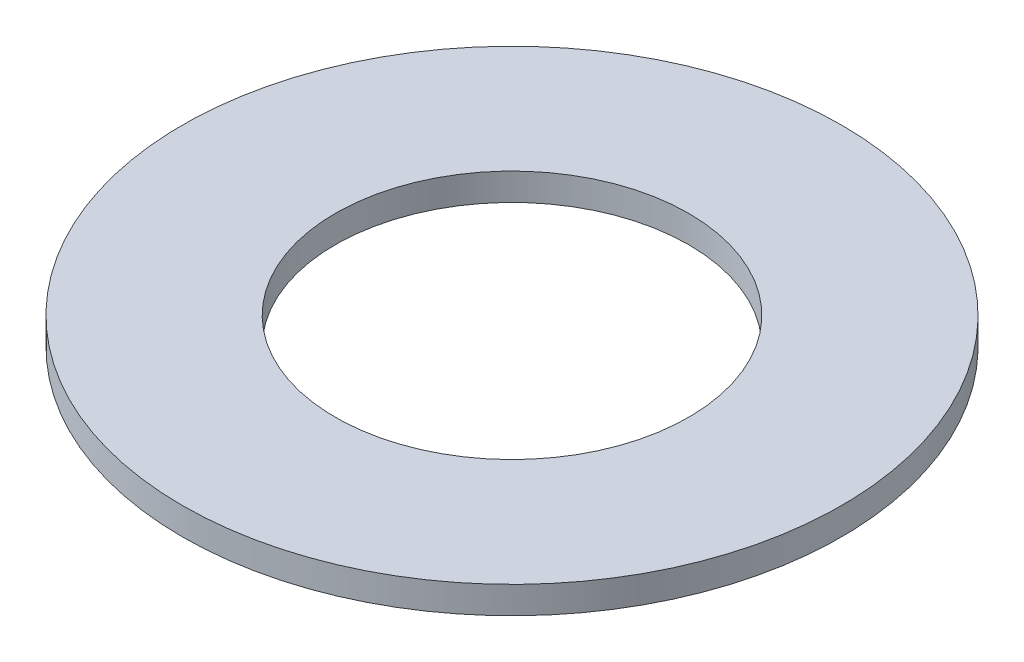
ISO-10303-21;
HEADER;
FILE_DESCRIPTION(('STEP AP214'),'2;1');
FILE_NAME('part.step','',(''),(''),'','','');
FILE_SCHEMA(('AUTOMOTIVE_DESIGN { 1 0 10303 214 1 1 1 1 }'));
ENDSEC;
DATA;
#1=APPLICATION_CONTEXT('core data for automotive mechanical design processes');
#2=APPLICATION_PROTOCOL_DEFINITION('international standard','automotive_design',2000,#1);
#3=PRODUCT_CONTEXT('',#1,'mechanical');
#4=PRODUCT('Part','Part','',(#3));
#5=PRODUCT_RELATED_PRODUCT_CATEGORY('part','',(#4));
#6=PRODUCT_DEFINITION_FORMATION('','',#4);
#7=PRODUCT_DEFINITION_CONTEXT('part definition',#1,'design');
#8=PRODUCT_DEFINITION('design','',#6,#7);
#9=PRODUCT_DEFINITION_SHAPE('','',#8);
#10=(LENGTH_UNIT() NAMED_UNIT(*) SI_UNIT(.MILLI.,.METRE.));
#11=(NAMED_UNIT(*) PLANE_ANGLE_UNIT() SI_UNIT($,.RADIAN.));
#12=(NAMED_UNIT(*) SI_UNIT($,.STERADIAN.) SOLID_ANGLE_UNIT());
#13=UNCERTAINTY_MEASURE_WITH_UNIT(LENGTH_MEASURE(1.E-05),#10,'distance_accuracy_value','');
#14=(GEOMETRIC_REPRESENTATION_CONTEXT(3) GLOBAL_UNCERTAINTY_ASSIGNED_CONTEXT((#13)) GLOBAL_UNIT_ASSIGNED_CONTEXT((#10,
#11,#12)) REPRESENTATION_CONTEXT('',''));
#15=CARTESIAN_POINT('',(0.,0.,0.));
#16=DIRECTION('',(0.,0.,1.));
#17=DIRECTION('',(1.,0.,0.));
#18=AXIS2_PLACEMENT_3D('',#15,#16,#17);
#19=CARTESIAN_POINT('',(0.,0.,0.));
#20=DIRECTION('',(0.,-1.,0.));
#21=DIRECTION('',(0.,0.,-1.));
#22=AXIS2_PLACEMENT_3D('',#19,#20,#21);
#23=CYLINDRICAL_SURFACE('',#22,26.);
#24=CARTESIAN_POINT('',(0.,4.,0.));
#25=DIRECTION('',(0.,-1.,0.));
#26=DIRECTION('',(0.,0.,-1.));
#27=AXIS2_PLACEMENT_3D('',#24,#25,#26);
#28=CIRCLE('',#27,26.);
#29=CARTESIAN_POINT('',(0.,4.,-26.));
#30=VERTEX_POINT('',#29);
#31=EDGE_CURVE('E10',#30,#30,#28,.T.);
#32=ORIENTED_EDGE('',*,*,#31,.F.);
#33=EDGE_LOOP('',(#32));
#34=FACE_BOUND('',#33,.T.);
#35=CARTESIAN_POINT('',(0.,0.,0.));
#36=DIRECTION('',(0.,-1.,0.));
#37=DIRECTION('',(0.,0.,-1.));
#38=AXIS2_PLACEMENT_3D('',#35,#36,#37);
#39=CIRCLE('',#38,26.);
#40=CARTESIAN_POINT('',(0.,0.,-26.));
#41=VERTEX_POINT('',#40);
#42=EDGE_CURVE('E47',#41,#41,#39,.T.);
#43=ORIENTED_EDGE('',*,*,#42,.T.);
#44=EDGE_LOOP('',(#43));
#45=FACE_BOUND('',#44,.T.);
#46=ADVANCED_FACE('F33',(#34,#45),#23,.F.);
#47=CARTESIAN_POINT('',(-26.,4.,0.));
#48=DIRECTION('',(0.,-1.,0.));
#49=DIRECTION('',(0.,0.,-1.));
#50=AXIS2_PLACEMENT_3D('',#47,#48,#49);
#51=PLANE('',#50);
#52=CARTESIAN_POINT('',(0.,4.,0.));
#53=DIRECTION('',(0.,-1.,0.));
#54=DIRECTION('',(0.,0.,-1.));
#55=AXIS2_PLACEMENT_3D('',#52,#53,#54);
#56=CIRCLE('',#55,48.5);
#57=CARTESIAN_POINT('',(0.,4.,-48.5));
#58=VERTEX_POINT('',#57);
#59=EDGE_CURVE('E39',#58,#58,#56,.T.);
#60=ORIENTED_EDGE('',*,*,#59,.F.);
#61=EDGE_LOOP('',(#60));
#62=FACE_BOUND('',#61,.T.);
#63=ORIENTED_EDGE('',*,*,#31,.T.);
#64=EDGE_LOOP('',(#63));
#65=FACE_BOUND('',#64,.T.);
#66=ADVANCED_FACE('F62',(#62,#65),#51,.F.);
#67=CARTESIAN_POINT('',(0.,0.,0.));
#68=DIRECTION('',(0.,-1.,0.));
#69=DIRECTION('',(0.,0.,-1.));
#70=AXIS2_PLACEMENT_3D('',#67,#68,#69);
#71=CYLINDRICAL_SURFACE('',#70,48.5);
#72=CARTESIAN_POINT('',(0.,0.,0.));
#73=DIRECTION('',(0.,-1.,0.));
#74=DIRECTION('',(0.,0.,-1.));
#75=AXIS2_PLACEMENT_3D('',#72,#73,#74);
#76=CIRCLE('',#75,48.5);
#77=CARTESIAN_POINT('',(0.,0.,-48.5));
#78=VERTEX_POINT('',#77);
#79=EDGE_CURVE('E43',#78,#78,#76,.T.);
#80=ORIENTED_EDGE('',*,*,#79,.F.);
#81=EDGE_LOOP('',(#80));
#82=FACE_BOUND('',#81,.T.);
#83=ORIENTED_EDGE('',*,*,#59,.T.);
#84=EDGE_LOOP('',(#83));
#85=FACE_BOUND('',#84,.T.);
#86=ADVANCED_FACE('F57',(#82,#85),#71,.T.);
#87=CARTESIAN_POINT('',(-48.5,0.,0.));
#88=DIRECTION('',(0.,1.,0.));
#89=DIRECTION('',(0.,0.,1.));
#90=AXIS2_PLACEMENT_3D('',#87,#88,#89);
#91=PLANE('',#90);
#92=ORIENTED_EDGE('',*,*,#42,.F.);
#93=EDGE_LOOP('',(#92));
#94=FACE_BOUND('',#93,.T.);
#95=ORIENTED_EDGE('',*,*,#79,.T.);
#96=EDGE_LOOP('',(#95));
#97=FACE_BOUND('',#96,.T.);
#98=ADVANCED_FACE('F54',(#94,#97),#91,.F.);
#99=CLOSED_SHELL('',(#46,#66,#86,#98));
#100=MANIFOLD_SOLID_BREP('B2',#99);
#101=ADVANCED_BREP_SHAPE_REPRESENTATION('',(#18,#100),#14);
#102=SHAPE_DEFINITION_REPRESENTATION(#9,#101);
ENDSEC;
END-ISO-10303-21;
